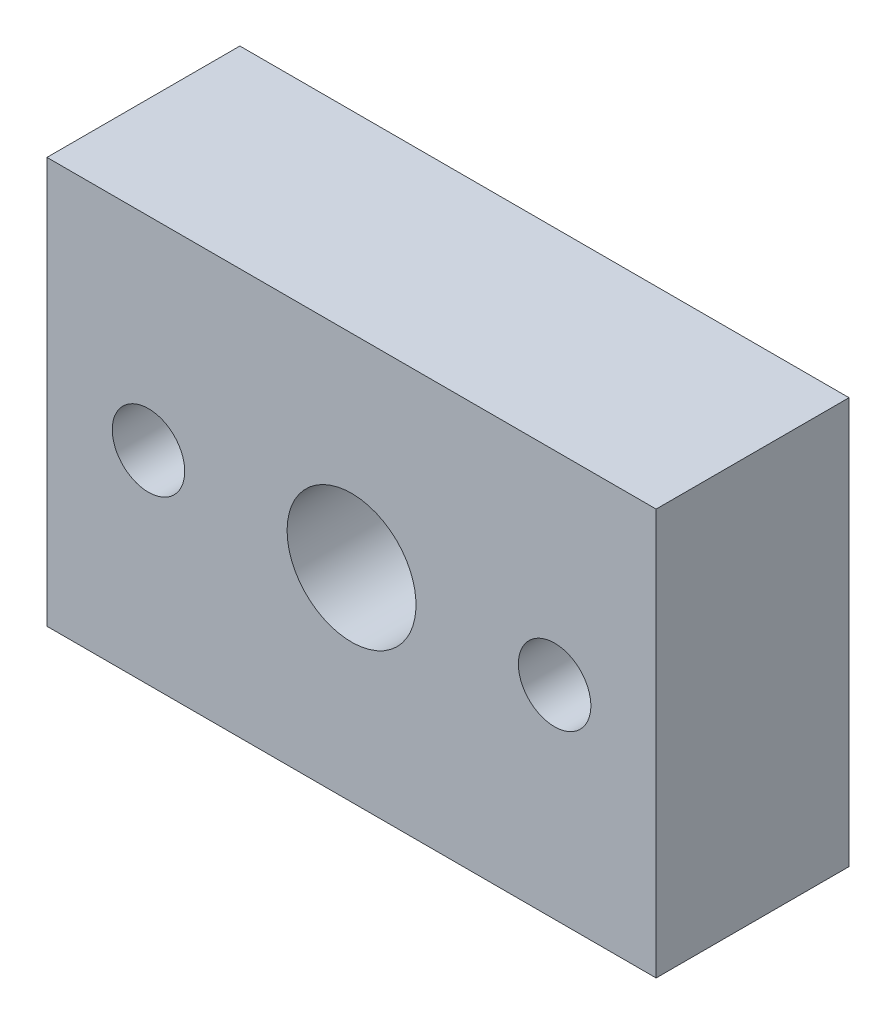
ISO-10303-21;
HEADER;
FILE_DESCRIPTION(('STEP AP214'),'2;1');
FILE_NAME('part.step','',(''),(''),'','','');
FILE_SCHEMA(('AUTOMOTIVE_DESIGN { 1 0 10303 214 1 1 1 1 }'));
ENDSEC;
DATA;
#1=APPLICATION_CONTEXT('core data for automotive mechanical design processes');
#2=APPLICATION_PROTOCOL_DEFINITION('international standard','automotive_design',2000,#1);
#3=PRODUCT_CONTEXT('',#1,'mechanical');
#4=PRODUCT('Part','Part','',(#3));
#5=PRODUCT_RELATED_PRODUCT_CATEGORY('part','',(#4));
#6=PRODUCT_DEFINITION_FORMATION('','',#4);
#7=PRODUCT_DEFINITION_CONTEXT('part definition',#1,'design');
#8=PRODUCT_DEFINITION('design','',#6,#7);
#9=PRODUCT_DEFINITION_SHAPE('','',#8);
#10=(LENGTH_UNIT() NAMED_UNIT(*) SI_UNIT(.MILLI.,.METRE.));
#11=(NAMED_UNIT(*) PLANE_ANGLE_UNIT() SI_UNIT($,.RADIAN.));
#12=(NAMED_UNIT(*) SI_UNIT($,.STERADIAN.) SOLID_ANGLE_UNIT());
#13=UNCERTAINTY_MEASURE_WITH_UNIT(LENGTH_MEASURE(1.E-05),#10,'distance_accuracy_value','');
#14=(GEOMETRIC_REPRESENTATION_CONTEXT(3) GLOBAL_UNCERTAINTY_ASSIGNED_CONTEXT((#13)) GLOBAL_UNIT_ASSIGNED_CONTEXT((#10,
#11,#12)) REPRESENTATION_CONTEXT('',''));
#15=CARTESIAN_POINT('',(0.,0.,0.));
#16=DIRECTION('',(0.,0.,1.));
#17=DIRECTION('',(1.,0.,0.));
#18=AXIS2_PLACEMENT_3D('',#15,#16,#17);
#19=CARTESIAN_POINT('',(20.,0.,19.));
#20=DIRECTION('',(0.,0.,-1.));
#21=DIRECTION('',(-1.,0.,0.));
#22=AXIS2_PLACEMENT_3D('',#19,#20,#21);
#23=CYLINDRICAL_SURFACE('',#22,3.57);
#24=DIRECTION('',(0.,0.,-1.));
#25=VECTOR('',#24,1.);
#26=CARTESIAN_POINT('',(16.43,0.,19.));
#27=LINE('',#26,#25);
#28=CARTESIAN_POINT('',(16.43,0.,19.));
#29=VERTEX_POINT('',#28);
#30=CARTESIAN_POINT('',(16.43,0.,0.));
#31=VERTEX_POINT('',#30);
#32=EDGE_CURVE('E10',#29,#31,#27,.T.);
#33=ORIENTED_EDGE('',*,*,#32,.F.);
#34=CARTESIAN_POINT('',(20.,0.,19.));
#35=DIRECTION('',(0.,0.,-1.));
#36=DIRECTION('',(-1.,0.,0.));
#37=AXIS2_PLACEMENT_3D('',#34,#35,#36);
#38=CIRCLE('',#37,3.57);
#39=EDGE_CURVE('E116',#29,#29,#38,.T.);
#40=ORIENTED_EDGE('',*,*,#39,.F.);
#41=ORIENTED_EDGE('',*,*,#32,.T.);
#42=CARTESIAN_POINT('',(20.,0.,0.));
#43=DIRECTION('',(0.,0.,-1.));
#44=DIRECTION('',(-1.,0.,0.));
#45=AXIS2_PLACEMENT_3D('',#42,#43,#44);
#46=CIRCLE('',#45,3.57);
#47=EDGE_CURVE('E99',#31,#31,#46,.T.);
#48=ORIENTED_EDGE('',*,*,#47,.T.);
#49=EDGE_LOOP('',(#33,#40,#41,#48));
#50=FACE_BOUND('',#49,.T.);
#51=ADVANCED_FACE('F16',(#50),#23,.F.);
#52=CARTESIAN_POINT('',(0.,0.,19.));
#53=DIRECTION('',(0.,0.,-1.));
#54=DIRECTION('',(-1.,0.,0.));
#55=AXIS2_PLACEMENT_3D('',#52,#53,#54);
#56=CYLINDRICAL_SURFACE('',#55,6.35);
#57=DIRECTION('',(0.,0.,-1.));
#58=VECTOR('',#57,1.);
#59=CARTESIAN_POINT('',(-6.35,0.,19.));
#60=LINE('',#59,#58);
#61=CARTESIAN_POINT('',(-6.35,0.,19.));
#62=VERTEX_POINT('',#61);
#63=CARTESIAN_POINT('',(-6.35,0.,0.));
#64=VERTEX_POINT('',#63);
#65=EDGE_CURVE('E25',#62,#64,#60,.T.);
#66=ORIENTED_EDGE('',*,*,#65,.F.);
#67=CARTESIAN_POINT('',(0.,0.,19.));
#68=DIRECTION('',(0.,0.,-1.));
#69=DIRECTION('',(-1.,0.,0.));
#70=AXIS2_PLACEMENT_3D('',#67,#68,#69);
#71=CIRCLE('',#70,6.35);
#72=EDGE_CURVE('E120',#62,#62,#71,.T.);
#73=ORIENTED_EDGE('',*,*,#72,.F.);
#74=ORIENTED_EDGE('',*,*,#65,.T.);
#75=CARTESIAN_POINT('',(0.,0.,0.));
#76=DIRECTION('',(0.,0.,-1.));
#77=DIRECTION('',(-1.,0.,0.));
#78=AXIS2_PLACEMENT_3D('',#75,#76,#77);
#79=CIRCLE('',#78,6.35);
#80=EDGE_CURVE('E106',#64,#64,#79,.T.);
#81=ORIENTED_EDGE('',*,*,#80,.T.);
#82=EDGE_LOOP('',(#66,#73,#74,#81));
#83=FACE_BOUND('',#82,.T.);
#84=ADVANCED_FACE('F282',(#83),#56,.F.);
#85=CARTESIAN_POINT('',(-20.,0.,19.));
#86=DIRECTION('',(0.,0.,-1.));
#87=DIRECTION('',(-1.,0.,0.));
#88=AXIS2_PLACEMENT_3D('',#85,#86,#87);
#89=CYLINDRICAL_SURFACE('',#88,3.57);
#90=DIRECTION('',(0.,0.,-1.));
#91=VECTOR('',#90,1.);
#92=CARTESIAN_POINT('',(-23.57,0.,19.));
#93=LINE('',#92,#91);
#94=CARTESIAN_POINT('',(-23.57,0.,19.));
#95=VERTEX_POINT('',#94);
#96=CARTESIAN_POINT('',(-23.57,0.,0.));
#97=VERTEX_POINT('',#96);
#98=EDGE_CURVE('E91',#95,#97,#93,.T.);
#99=ORIENTED_EDGE('',*,*,#98,.F.);
#100=CARTESIAN_POINT('',(-20.,0.,19.));
#101=DIRECTION('',(0.,0.,-1.));
#102=DIRECTION('',(-1.,0.,0.));
#103=AXIS2_PLACEMENT_3D('',#100,#101,#102);
#104=CIRCLE('',#103,3.57);
#105=EDGE_CURVE('E98',#95,#95,#104,.T.);
#106=ORIENTED_EDGE('',*,*,#105,.F.);
#107=ORIENTED_EDGE('',*,*,#98,.T.);
#108=CARTESIAN_POINT('',(-20.,0.,0.));
#109=DIRECTION('',(0.,0.,-1.));
#110=DIRECTION('',(-1.,0.,0.));
#111=AXIS2_PLACEMENT_3D('',#108,#109,#110);
#112=CIRCLE('',#111,3.57);
#113=EDGE_CURVE('E96',#97,#97,#112,.T.);
#114=ORIENTED_EDGE('',*,*,#113,.T.);
#115=EDGE_LOOP('',(#99,#106,#107,#114));
#116=FACE_BOUND('',#115,.T.);
#117=ADVANCED_FACE('F94',(#116),#89,.F.);
#118=CARTESIAN_POINT('',(30.,-20.,0.));
#119=DIRECTION('',(1.,0.,0.));
#120=DIRECTION('',(0.,1.,0.));
#121=AXIS2_PLACEMENT_3D('',#118,#119,#120);
#122=PLANE('',#121);
#123=DIRECTION('',(0.,0.,1.));
#124=VECTOR('',#123,1.);
#125=CARTESIAN_POINT('',(30.,-20.,0.));
#126=LINE('',#125,#124);
#127=CARTESIAN_POINT('',(30.,-20.,0.));
#128=VERTEX_POINT('',#127);
#129=CARTESIAN_POINT('',(30.,-20.,19.));
#130=VERTEX_POINT('',#129);
#131=EDGE_CURVE('E139',#128,#130,#126,.T.);
#132=ORIENTED_EDGE('',*,*,#131,.F.);
#133=DIRECTION('',(0.,1.,0.));
#134=VECTOR('',#133,1.);
#135=CARTESIAN_POINT('',(30.,-20.,0.));
#136=LINE('',#135,#134);
#137=CARTESIAN_POINT('',(30.,20.,0.));
#138=VERTEX_POINT('',#137);
#139=EDGE_CURVE('E84',#128,#138,#136,.T.);
#140=ORIENTED_EDGE('',*,*,#139,.T.);
#141=DIRECTION('',(0.,0.,1.));
#142=VECTOR('',#141,1.);
#143=CARTESIAN_POINT('',(30.,20.,0.));
#144=LINE('',#143,#142);
#145=CARTESIAN_POINT('',(30.,20.,19.));
#146=VERTEX_POINT('',#145);
#147=EDGE_CURVE('E108',#138,#146,#144,.T.);
#148=ORIENTED_EDGE('',*,*,#147,.T.);
#149=DIRECTION('',(0.,1.,0.));
#150=VECTOR('',#149,1.);
#151=CARTESIAN_POINT('',(30.,-20.,19.));
#152=LINE('',#151,#150);
#153=EDGE_CURVE('E128',#130,#146,#152,.T.);
#154=ORIENTED_EDGE('',*,*,#153,.F.);
#155=EDGE_LOOP('',(#132,#140,#148,#154));
#156=FACE_BOUND('',#155,.T.);
#157=ADVANCED_FACE('F310',(#156),#122,.T.);
#158=CARTESIAN_POINT('',(-30.,-20.,0.));
#159=DIRECTION('',(0.,0.,1.));
#160=DIRECTION('',(1.,0.,0.));
#161=AXIS2_PLACEMENT_3D('',#158,#159,#160);
#162=PLANE('',#161);
#163=ORIENTED_EDGE('',*,*,#47,.F.);
#164=EDGE_LOOP('',(#163));
#165=FACE_BOUND('',#164,.T.);
#166=ORIENTED_EDGE('',*,*,#80,.F.);
#167=EDGE_LOOP('',(#166));
#168=FACE_BOUND('',#167,.T.);
#169=ORIENTED_EDGE('',*,*,#113,.F.);
#170=EDGE_LOOP('',(#169));
#171=FACE_BOUND('',#170,.T.);
#172=DIRECTION('',(1.,0.,0.));
#173=VECTOR('',#172,1.);
#174=CARTESIAN_POINT('',(-30.,20.,0.));
#175=LINE('',#174,#173);
#176=CARTESIAN_POINT('',(-30.,20.,0.));
#177=VERTEX_POINT('',#176);
#178=EDGE_CURVE('E115',#177,#138,#175,.T.);
#179=ORIENTED_EDGE('',*,*,#178,.T.);
#180=ORIENTED_EDGE('',*,*,#139,.F.);
#181=DIRECTION('',(1.,0.,0.));
#182=VECTOR('',#181,1.);
#183=CARTESIAN_POINT('',(-30.,-20.,0.));
#184=LINE('',#183,#182);
#185=CARTESIAN_POINT('',(-30.,-20.,0.));
#186=VERTEX_POINT('',#185);
#187=EDGE_CURVE('E135',#186,#128,#184,.T.);
#188=ORIENTED_EDGE('',*,*,#187,.F.);
#189=DIRECTION('',(0.,1.,0.));
#190=VECTOR('',#189,1.);
#191=CARTESIAN_POINT('',(-30.,-20.,0.));
#192=LINE('',#191,#190);
#193=EDGE_CURVE('E149',#186,#177,#192,.T.);
#194=ORIENTED_EDGE('',*,*,#193,.T.);
#195=EDGE_LOOP('',(#179,#180,#188,#194));
#196=FACE_BOUND('',#195,.T.);
#197=ADVANCED_FACE('F302',(#165,#168,#171,#196),#162,.F.);
#198=CARTESIAN_POINT('',(-30.,20.,0.));
#199=DIRECTION('',(0.,1.,0.));
#200=DIRECTION('',(1.,0.,0.));
#201=AXIS2_PLACEMENT_3D('',#198,#199,#200);
#202=PLANE('',#201);
#203=ORIENTED_EDGE('',*,*,#178,.F.);
#204=DIRECTION('',(0.,0.,1.));
#205=VECTOR('',#204,1.);
#206=CARTESIAN_POINT('',(-30.,20.,0.));
#207=LINE('',#206,#205);
#208=CARTESIAN_POINT('',(-30.,20.,19.));
#209=VERTEX_POINT('',#208);
#210=EDGE_CURVE('E152',#177,#209,#207,.T.);
#211=ORIENTED_EDGE('',*,*,#210,.T.);
#212=DIRECTION('',(1.,0.,0.));
#213=VECTOR('',#212,1.);
#214=CARTESIAN_POINT('',(-30.,20.,19.));
#215=LINE('',#214,#213);
#216=EDGE_CURVE('E121',#209,#146,#215,.T.);
#217=ORIENTED_EDGE('',*,*,#216,.T.);
#218=ORIENTED_EDGE('',*,*,#147,.F.);
#219=EDGE_LOOP('',(#203,#211,#217,#218));
#220=FACE_BOUND('',#219,.T.);
#221=ADVANCED_FACE('F300',(#220),#202,.T.);
#222=CARTESIAN_POINT('',(-30.,-20.,19.));
#223=DIRECTION('',(0.,0.,1.));
#224=DIRECTION('',(1.,0.,0.));
#225=AXIS2_PLACEMENT_3D('',#222,#223,#224);
#226=PLANE('',#225);
#227=ORIENTED_EDGE('',*,*,#39,.T.);
#228=EDGE_LOOP('',(#227));
#229=FACE_BOUND('',#228,.T.);
#230=ORIENTED_EDGE('',*,*,#72,.T.);
#231=EDGE_LOOP('',(#230));
#232=FACE_BOUND('',#231,.T.);
#233=ORIENTED_EDGE('',*,*,#105,.T.);
#234=EDGE_LOOP('',(#233));
#235=FACE_BOUND('',#234,.T.);
#236=DIRECTION('',(0.,1.,0.));
#237=VECTOR('',#236,1.);
#238=CARTESIAN_POINT('',(-30.,-20.,19.));
#239=LINE('',#238,#237);
#240=CARTESIAN_POINT('',(-30.,-20.,19.));
#241=VERTEX_POINT('',#240);
#242=EDGE_CURVE('E161',#241,#209,#239,.T.);
#243=ORIENTED_EDGE('',*,*,#242,.F.);
#244=DIRECTION('',(1.,0.,0.));
#245=VECTOR('',#244,1.);
#246=CARTESIAN_POINT('',(-30.,-20.,19.));
#247=LINE('',#246,#245);
#248=EDGE_CURVE('E136',#241,#130,#247,.T.);
#249=ORIENTED_EDGE('',*,*,#248,.T.);
#250=ORIENTED_EDGE('',*,*,#153,.T.);
#251=ORIENTED_EDGE('',*,*,#216,.F.);
#252=EDGE_LOOP('',(#243,#249,#250,#251));
#253=FACE_BOUND('',#252,.T.);
#254=ADVANCED_FACE('F274',(#229,#232,#235,#253),#226,.T.);
#255=CARTESIAN_POINT('',(-30.,-20.,0.));
#256=DIRECTION('',(0.,1.,0.));
#257=DIRECTION('',(1.,0.,0.));
#258=AXIS2_PLACEMENT_3D('',#255,#256,#257);
#259=PLANE('',#258);
#260=ORIENTED_EDGE('',*,*,#131,.T.);
#261=ORIENTED_EDGE('',*,*,#248,.F.);
#262=DIRECTION('',(0.,0.,1.));
#263=VECTOR('',#262,1.);
#264=CARTESIAN_POINT('',(-30.,-20.,0.));
#265=LINE('',#264,#263);
#266=EDGE_CURVE('E148',#186,#241,#265,.T.);
#267=ORIENTED_EDGE('',*,*,#266,.F.);
#268=ORIENTED_EDGE('',*,*,#187,.T.);
#269=EDGE_LOOP('',(#260,#261,#267,#268));
#270=FACE_BOUND('',#269,.T.);
#271=ADVANCED_FACE('F262',(#270),#259,.F.);
#272=CARTESIAN_POINT('',(-30.,-20.,0.));
#273=DIRECTION('',(1.,0.,0.));
#274=DIRECTION('',(0.,1.,0.));
#275=AXIS2_PLACEMENT_3D('',#272,#273,#274);
#276=PLANE('',#275);
#277=ORIENTED_EDGE('',*,*,#242,.T.);
#278=ORIENTED_EDGE('',*,*,#210,.F.);
#279=ORIENTED_EDGE('',*,*,#193,.F.);
#280=ORIENTED_EDGE('',*,*,#266,.T.);
#281=EDGE_LOOP('',(#277,#278,#279,#280));
#282=FACE_BOUND('',#281,.T.);
#283=ADVANCED_FACE('F259',(#282),#276,.F.);
#284=CLOSED_SHELL('',(#51,#84,#117,#157,#197,#221,#254,#271,#283));
#285=MANIFOLD_SOLID_BREP('B1',#284);
#286=ADVANCED_BREP_SHAPE_REPRESENTATION('',(#18,#285),#14);
#287=SHAPE_DEFINITION_REPRESENTATION(#9,#286);
ENDSEC;
END-ISO-10303-21;
